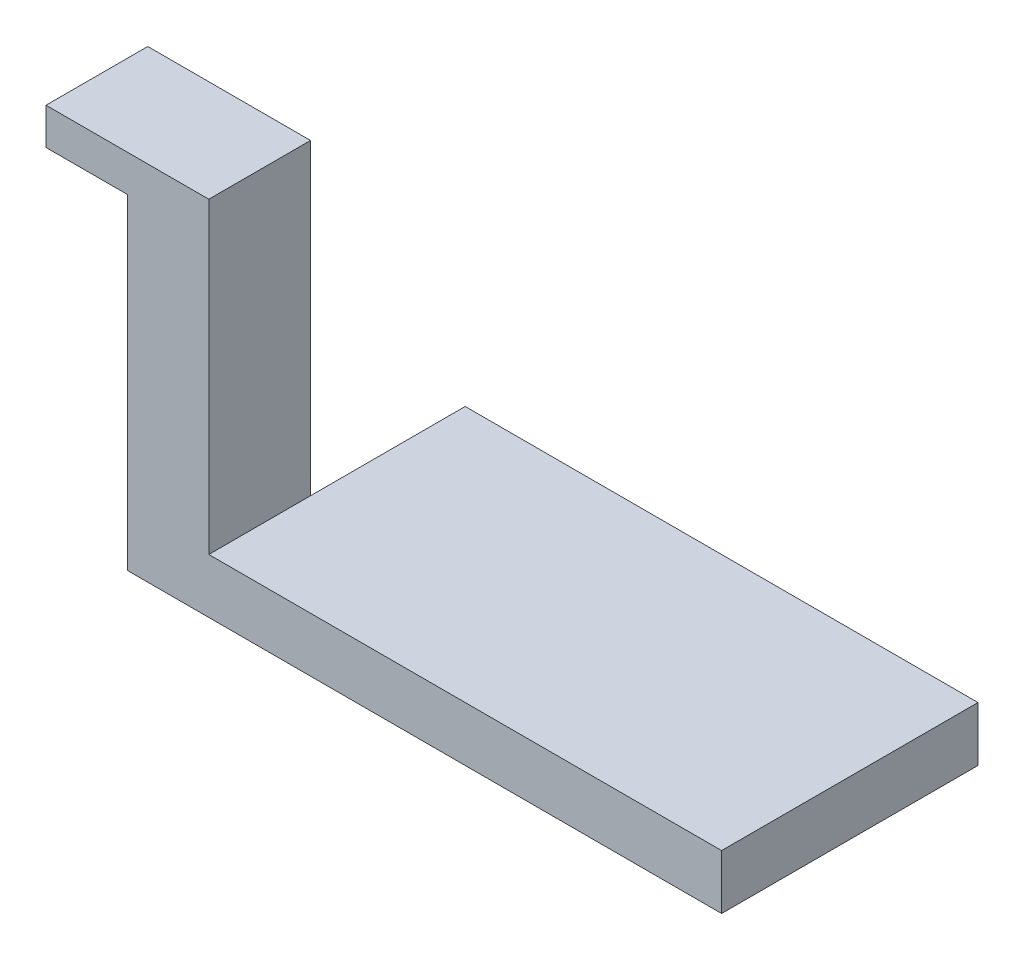
ISO-10303-21;
HEADER;
FILE_DESCRIPTION(('STEP AP214'),'2;1');
FILE_NAME('part.step','',(''),(''),'','','');
FILE_SCHEMA(('AUTOMOTIVE_DESIGN { 1 0 10303 214 1 1 1 1 }'));
ENDSEC;
DATA;
#1=APPLICATION_CONTEXT('core data for automotive mechanical design processes');
#2=APPLICATION_PROTOCOL_DEFINITION('international standard','automotive_design',2000,#1);
#3=PRODUCT_CONTEXT('',#1,'mechanical');
#4=PRODUCT('Part','Part','',(#3));
#5=PRODUCT_RELATED_PRODUCT_CATEGORY('part','',(#4));
#6=PRODUCT_DEFINITION_FORMATION('','',#4);
#7=PRODUCT_DEFINITION_CONTEXT('part definition',#1,'design');
#8=PRODUCT_DEFINITION('design','',#6,#7);
#9=PRODUCT_DEFINITION_SHAPE('','',#8);
#10=(LENGTH_UNIT() NAMED_UNIT(*) SI_UNIT(.MILLI.,.METRE.));
#11=(NAMED_UNIT(*) PLANE_ANGLE_UNIT() SI_UNIT($,.RADIAN.));
#12=(NAMED_UNIT(*) SI_UNIT($,.STERADIAN.) SOLID_ANGLE_UNIT());
#13=UNCERTAINTY_MEASURE_WITH_UNIT(LENGTH_MEASURE(1.E-05),#10,'distance_accuracy_value','');
#14=(GEOMETRIC_REPRESENTATION_CONTEXT(3) GLOBAL_UNCERTAINTY_ASSIGNED_CONTEXT((#13)) GLOBAL_UNIT_ASSIGNED_CONTEXT((#10,
#11,#12)) REPRESENTATION_CONTEXT('',''));
#15=CARTESIAN_POINT('',(0.,0.,0.));
#16=DIRECTION('',(0.,0.,1.));
#17=DIRECTION('',(1.,0.,0.));
#18=AXIS2_PLACEMENT_3D('',#15,#16,#17);
#19=CARTESIAN_POINT('',(10.16,2.286,0.));
#20=DIRECTION('',(-1.,0.,0.));
#21=DIRECTION('',(0.,0.,1.));
#22=AXIS2_PLACEMENT_3D('',#19,#20,#21);
#23=PLANE('',#22);
#24=DIRECTION('',(0.,0.,1.));
#25=VECTOR('',#24,1.);
#26=CARTESIAN_POINT('',(10.16,-16.9164,-16.002));
#27=LINE('',#26,#25);
#28=CARTESIAN_POINT('',(10.16,-16.9164,-6.35));
#29=VERTEX_POINT('',#28);
#30=CARTESIAN_POINT('',(10.16,-16.9164,0.));
#31=VERTEX_POINT('',#30);
#32=EDGE_CURVE('E11',#29,#31,#27,.T.);
#33=ORIENTED_EDGE('',*,*,#32,.F.);
#34=DIRECTION('',(0.,-1.,0.));
#35=VECTOR('',#34,1.);
#36=CARTESIAN_POINT('',(10.16,2.286,-6.35));
#37=LINE('',#36,#35);
#38=CARTESIAN_POINT('',(10.16,2.286,-6.35));
#39=VERTEX_POINT('',#38);
#40=EDGE_CURVE('E273',#39,#29,#37,.T.);
#41=ORIENTED_EDGE('',*,*,#40,.F.);
#42=DIRECTION('',(0.,0.,-1.));
#43=VECTOR('',#42,1.);
#44=CARTESIAN_POINT('',(10.16,2.286,0.));
#45=LINE('',#44,#43);
#46=CARTESIAN_POINT('',(10.16,2.286,0.));
#47=VERTEX_POINT('',#46);
#48=EDGE_CURVE('E254',#47,#39,#45,.T.);
#49=ORIENTED_EDGE('',*,*,#48,.F.);
#50=DIRECTION('',(0.,-1.,0.));
#51=VECTOR('',#50,1.);
#52=CARTESIAN_POINT('',(10.16,2.286,0.));
#53=LINE('',#52,#51);
#54=EDGE_CURVE('E275',#47,#31,#53,.T.);
#55=ORIENTED_EDGE('',*,*,#54,.T.);
#56=EDGE_LOOP('',(#33,#41,#49,#55));
#57=FACE_BOUND('',#56,.T.);
#58=ADVANCED_FACE('F45',(#57),#23,.F.);
#59=CARTESIAN_POINT('',(0.,2.286,0.));
#60=DIRECTION('',(1.,0.,0.));
#61=DIRECTION('',(0.,0.,-1.));
#62=AXIS2_PLACEMENT_3D('',#59,#60,#61);
#63=PLANE('',#62);
#64=DIRECTION('',(0.,0.,1.));
#65=VECTOR('',#64,1.);
#66=CARTESIAN_POINT('',(0.,0.3302,-6.0452));
#67=LINE('',#66,#65);
#68=CARTESIAN_POINT('',(0.,0.3302,-6.0452));
#69=VERTEX_POINT('',#68);
#70=CARTESIAN_POINT('',(0.,0.3302,-0.2032));
#71=VERTEX_POINT('',#70);
#72=EDGE_CURVE('E222',#69,#71,#67,.T.);
#73=ORIENTED_EDGE('',*,*,#72,.F.);
#74=DIRECTION('',(0.,-1.,0.));
#75=VECTOR('',#74,1.);
#76=CARTESIAN_POINT('',(0.,1.9812,-6.0452));
#77=LINE('',#76,#75);
#78=CARTESIAN_POINT('',(0.,1.9812,-6.0452));
#79=VERTEX_POINT('',#78);
#80=EDGE_CURVE('E201',#79,#69,#77,.T.);
#81=ORIENTED_EDGE('',*,*,#80,.F.);
#82=DIRECTION('',(0.,0.,-1.));
#83=VECTOR('',#82,1.);
#84=CARTESIAN_POINT('',(0.,1.9812,-6.0452));
#85=LINE('',#84,#83);
#86=CARTESIAN_POINT('',(0.,1.9812,-0.2032));
#87=VERTEX_POINT('',#86);
#88=EDGE_CURVE('E207',#87,#79,#85,.T.);
#89=ORIENTED_EDGE('',*,*,#88,.F.);
#90=DIRECTION('',(0.,1.,0.));
#91=VECTOR('',#90,1.);
#92=CARTESIAN_POINT('',(0.,1.9812,-0.2032));
#93=LINE('',#92,#91);
#94=EDGE_CURVE('E226',#71,#87,#93,.T.);
#95=ORIENTED_EDGE('',*,*,#94,.F.);
#96=EDGE_LOOP('',(#73,#81,#89,#95));
#97=FACE_BOUND('',#96,.T.);
#98=DIRECTION('',(0.,0.,1.));
#99=VECTOR('',#98,1.);
#100=CARTESIAN_POINT('',(0.,0.,0.));
#101=LINE('',#100,#99);
#102=CARTESIAN_POINT('',(0.,0.,-6.35));
#103=VERTEX_POINT('',#102);
#104=CARTESIAN_POINT('',(0.,0.,0.));
#105=VERTEX_POINT('',#104);
#106=EDGE_CURVE('E236',#103,#105,#101,.T.);
#107=ORIENTED_EDGE('',*,*,#106,.T.);
#108=DIRECTION('',(0.,-1.,0.));
#109=VECTOR('',#108,1.);
#110=CARTESIAN_POINT('',(0.,2.286,0.));
#111=LINE('',#110,#109);
#112=CARTESIAN_POINT('',(0.,2.286,0.));
#113=VERTEX_POINT('',#112);
#114=EDGE_CURVE('E49',#113,#105,#111,.T.);
#115=ORIENTED_EDGE('',*,*,#114,.F.);
#116=DIRECTION('',(0.,0.,1.));
#117=VECTOR('',#116,1.);
#118=CARTESIAN_POINT('',(0.,2.286,0.));
#119=LINE('',#118,#117);
#120=CARTESIAN_POINT('',(0.,2.286,-6.35));
#121=VERTEX_POINT('',#120);
#122=EDGE_CURVE('E246',#121,#113,#119,.T.);
#123=ORIENTED_EDGE('',*,*,#122,.F.);
#124=DIRECTION('',(0.,-1.,0.));
#125=VECTOR('',#124,1.);
#126=CARTESIAN_POINT('',(0.,2.286,-6.35));
#127=LINE('',#126,#125);
#128=EDGE_CURVE('E260',#121,#103,#127,.T.);
#129=ORIENTED_EDGE('',*,*,#128,.T.);
#130=EDGE_LOOP('',(#107,#115,#123,#129));
#131=FACE_BOUND('',#130,.T.);
#132=ADVANCED_FACE('F47',(#97,#131),#63,.F.);
#133=CARTESIAN_POINT('',(0.,2.286,0.));
#134=DIRECTION('',(0.,0.,-1.));
#135=DIRECTION('',(-1.,0.,0.));
#136=AXIS2_PLACEMENT_3D('',#133,#134,#135);
#137=PLANE('',#136);
#138=DIRECTION('',(1.,0.,0.));
#139=VECTOR('',#138,1.);
#140=CARTESIAN_POINT('',(0.,0.,0.));
#141=LINE('',#140,#139);
#142=CARTESIAN_POINT('',(5.08,0.,0.));
#143=VERTEX_POINT('',#142);
#144=EDGE_CURVE('E264',#105,#143,#141,.T.);
#145=ORIENTED_EDGE('',*,*,#144,.T.);
#146=DIRECTION('',(0.,1.,0.));
#147=VECTOR('',#146,1.);
#148=CARTESIAN_POINT('',(5.08,-20.32,0.));
#149=LINE('',#148,#147);
#150=CARTESIAN_POINT('',(5.08,-20.32,0.));
#151=VERTEX_POINT('',#150);
#152=EDGE_CURVE('E197',#151,#143,#149,.T.);
#153=ORIENTED_EDGE('',*,*,#152,.F.);
#154=DIRECTION('',(-1.,0.,0.));
#155=VECTOR('',#154,1.);
#156=CARTESIAN_POINT('',(10.16,-20.32,0.));
#157=LINE('',#156,#155);
#158=CARTESIAN_POINT('',(42.164,-20.32,0.));
#159=VERTEX_POINT('',#158);
#160=EDGE_CURVE('E178',#159,#151,#157,.T.);
#161=ORIENTED_EDGE('',*,*,#160,.F.);
#162=DIRECTION('',(0.,-1.,0.));
#163=VECTOR('',#162,1.);
#164=CARTESIAN_POINT('',(42.164,-20.32,0.));
#165=LINE('',#164,#163);
#166=CARTESIAN_POINT('',(42.164,-16.9164,0.));
#167=VERTEX_POINT('',#166);
#168=EDGE_CURVE('E158',#167,#159,#165,.T.);
#169=ORIENTED_EDGE('',*,*,#168,.F.);
#170=DIRECTION('',(-1.,0.,0.));
#171=VECTOR('',#170,1.);
#172=CARTESIAN_POINT('',(42.164,-16.9164,0.));
#173=LINE('',#172,#171);
#174=EDGE_CURVE('E153',#167,#31,#173,.T.);
#175=ORIENTED_EDGE('',*,*,#174,.T.);
#176=ORIENTED_EDGE('',*,*,#54,.F.);
#177=DIRECTION('',(1.,0.,0.));
#178=VECTOR('',#177,1.);
#179=CARTESIAN_POINT('',(0.,2.286,0.));
#180=LINE('',#179,#178);
#181=EDGE_CURVE('E250',#113,#47,#180,.T.);
#182=ORIENTED_EDGE('',*,*,#181,.F.);
#183=ORIENTED_EDGE('',*,*,#114,.T.);
#184=EDGE_LOOP('',(#145,#153,#161,#169,#175,#176,#182,#183));
#185=FACE_BOUND('',#184,.T.);
#186=ADVANCED_FACE('F283',(#185),#137,.F.);
#187=CARTESIAN_POINT('',(0.,2.286,-6.35));
#188=DIRECTION('',(0.,0.,1.));
#189=DIRECTION('',(1.,0.,0.));
#190=AXIS2_PLACEMENT_3D('',#187,#188,#189);
#191=PLANE('',#190);
#192=ORIENTED_EDGE('',*,*,#40,.T.);
#193=CARTESIAN_POINT('',(10.16,-20.32,-6.35));
#194=VERTEX_POINT('',#193);
#195=EDGE_CURVE('E272',#29,#194,#37,.T.);
#196=ORIENTED_EDGE('',*,*,#195,.T.);
#197=DIRECTION('',(1.,0.,0.));
#198=VECTOR('',#197,1.);
#199=CARTESIAN_POINT('',(10.16,-20.32,-6.35));
#200=LINE('',#199,#198);
#201=CARTESIAN_POINT('',(5.08,-20.32,-6.35));
#202=VERTEX_POINT('',#201);
#203=EDGE_CURVE('E189',#202,#194,#200,.T.);
#204=ORIENTED_EDGE('',*,*,#203,.F.);
#205=DIRECTION('',(0.,1.,0.));
#206=VECTOR('',#205,1.);
#207=CARTESIAN_POINT('',(5.08,-20.32,-6.35));
#208=LINE('',#207,#206);
#209=CARTESIAN_POINT('',(5.08,0.,-6.35));
#210=VERTEX_POINT('',#209);
#211=EDGE_CURVE('E192',#202,#210,#208,.T.);
#212=ORIENTED_EDGE('',*,*,#211,.T.);
#213=DIRECTION('',(-1.,0.,0.));
#214=VECTOR('',#213,1.);
#215=CARTESIAN_POINT('',(0.,0.,-6.35));
#216=LINE('',#215,#214);
#217=EDGE_CURVE('E251',#210,#103,#216,.T.);
#218=ORIENTED_EDGE('',*,*,#217,.T.);
#219=ORIENTED_EDGE('',*,*,#128,.F.);
#220=DIRECTION('',(-1.,0.,0.));
#221=VECTOR('',#220,1.);
#222=CARTESIAN_POINT('',(0.,2.286,-6.35));
#223=LINE('',#222,#221);
#224=EDGE_CURVE('E257',#39,#121,#223,.T.);
#225=ORIENTED_EDGE('',*,*,#224,.F.);
#226=EDGE_LOOP('',(#192,#196,#204,#212,#218,#219,#225));
#227=FACE_BOUND('',#226,.T.);
#228=ADVANCED_FACE('F296',(#227),#191,.F.);
#229=CARTESIAN_POINT('',(0.,2.286,0.));
#230=DIRECTION('',(0.,-1.,0.));
#231=DIRECTION('',(0.,0.,-1.));
#232=AXIS2_PLACEMENT_3D('',#229,#230,#231);
#233=PLANE('',#232);
#234=ORIENTED_EDGE('',*,*,#122,.T.);
#235=ORIENTED_EDGE('',*,*,#181,.T.);
#236=ORIENTED_EDGE('',*,*,#48,.T.);
#237=ORIENTED_EDGE('',*,*,#224,.T.);
#238=EDGE_LOOP('',(#234,#235,#236,#237));
#239=FACE_BOUND('',#238,.T.);
#240=ADVANCED_FACE('F315',(#239),#233,.F.);
#241=CARTESIAN_POINT('',(0.,0.,0.));
#242=DIRECTION('',(0.,-1.,0.));
#243=DIRECTION('',(0.,0.,-1.));
#244=AXIS2_PLACEMENT_3D('',#241,#242,#243);
#245=PLANE('',#244);
#246=DIRECTION('',(0.,0.,-1.));
#247=VECTOR('',#246,1.);
#248=CARTESIAN_POINT('',(5.08,0.,-6.35));
#249=LINE('',#248,#247);
#250=EDGE_CURVE('E69',#143,#210,#249,.T.);
#251=ORIENTED_EDGE('',*,*,#250,.F.);
#252=ORIENTED_EDGE('',*,*,#144,.F.);
#253=ORIENTED_EDGE('',*,*,#106,.F.);
#254=ORIENTED_EDGE('',*,*,#217,.F.);
#255=EDGE_LOOP('',(#251,#252,#253,#254));
#256=FACE_BOUND('',#255,.T.);
#257=ADVANCED_FACE('F289',(#256),#245,.T.);
#258=CARTESIAN_POINT('',(8.89,1.9812,-6.0452));
#259=DIRECTION('',(0.,0.,-1.));
#260=DIRECTION('',(-1.,0.,0.));
#261=AXIS2_PLACEMENT_3D('',#258,#259,#260);
#262=PLANE('',#261);
#263=ORIENTED_EDGE('',*,*,#80,.T.);
#264=DIRECTION('',(-1.,0.,0.));
#265=VECTOR('',#264,1.);
#266=CARTESIAN_POINT('',(8.89,0.3302,-6.0452));
#267=LINE('',#266,#265);
#268=CARTESIAN_POINT('',(8.89,0.3302,-6.0452));
#269=VERTEX_POINT('',#268);
#270=EDGE_CURVE('E219',#269,#69,#267,.T.);
#271=ORIENTED_EDGE('',*,*,#270,.F.);
#272=DIRECTION('',(0.,-1.,0.));
#273=VECTOR('',#272,1.);
#274=CARTESIAN_POINT('',(8.89,1.9812,-6.0452));
#275=LINE('',#274,#273);
#276=CARTESIAN_POINT('',(8.89,1.9812,-6.0452));
#277=VERTEX_POINT('',#276);
#278=EDGE_CURVE('E202',#277,#269,#275,.T.);
#279=ORIENTED_EDGE('',*,*,#278,.F.);
#280=DIRECTION('',(-1.,0.,0.));
#281=VECTOR('',#280,1.);
#282=CARTESIAN_POINT('',(8.89,1.9812,-6.0452));
#283=LINE('',#282,#281);
#284=EDGE_CURVE('E233',#277,#79,#283,.T.);
#285=ORIENTED_EDGE('',*,*,#284,.T.);
#286=EDGE_LOOP('',(#263,#271,#279,#285));
#287=FACE_BOUND('',#286,.T.);
#288=ADVANCED_FACE('F322',(#287),#262,.F.);
#289=CARTESIAN_POINT('',(8.89,1.9812,-6.0452));
#290=DIRECTION('',(0.,1.,0.));
#291=DIRECTION('',(0.,0.,1.));
#292=AXIS2_PLACEMENT_3D('',#289,#290,#291);
#293=PLANE('',#292);
#294=ORIENTED_EDGE('',*,*,#88,.T.);
#295=ORIENTED_EDGE('',*,*,#284,.F.);
#296=DIRECTION('',(0.,0.,-1.));
#297=VECTOR('',#296,1.);
#298=CARTESIAN_POINT('',(8.89,1.9812,-6.0452));
#299=LINE('',#298,#297);
#300=CARTESIAN_POINT('',(8.89,1.9812,-0.2032));
#301=VERTEX_POINT('',#300);
#302=EDGE_CURVE('E215',#301,#277,#299,.T.);
#303=ORIENTED_EDGE('',*,*,#302,.F.);
#304=DIRECTION('',(-1.,0.,0.));
#305=VECTOR('',#304,1.);
#306=CARTESIAN_POINT('',(8.89,1.9812,-0.2032));
#307=LINE('',#306,#305);
#308=EDGE_CURVE('E237',#301,#87,#307,.T.);
#309=ORIENTED_EDGE('',*,*,#308,.T.);
#310=EDGE_LOOP('',(#294,#295,#303,#309));
#311=FACE_BOUND('',#310,.T.);
#312=ADVANCED_FACE('F422',(#311),#293,.F.);
#313=CARTESIAN_POINT('',(8.89,1.9812,-0.2032));
#314=DIRECTION('',(0.,0.,1.));
#315=DIRECTION('',(1.,0.,0.));
#316=AXIS2_PLACEMENT_3D('',#313,#314,#315);
#317=PLANE('',#316);
#318=ORIENTED_EDGE('',*,*,#94,.T.);
#319=ORIENTED_EDGE('',*,*,#308,.F.);
#320=DIRECTION('',(0.,1.,0.));
#321=VECTOR('',#320,1.);
#322=CARTESIAN_POINT('',(8.89,1.9812,-0.2032));
#323=LINE('',#322,#321);
#324=CARTESIAN_POINT('',(8.89,0.3302,-0.2032));
#325=VERTEX_POINT('',#324);
#326=EDGE_CURVE('E211',#325,#301,#323,.T.);
#327=ORIENTED_EDGE('',*,*,#326,.F.);
#328=DIRECTION('',(-1.,0.,0.));
#329=VECTOR('',#328,1.);
#330=CARTESIAN_POINT('',(8.89,0.3302,-0.2032));
#331=LINE('',#330,#329);
#332=EDGE_CURVE('E240',#325,#71,#331,.T.);
#333=ORIENTED_EDGE('',*,*,#332,.T.);
#334=EDGE_LOOP('',(#318,#319,#327,#333));
#335=FACE_BOUND('',#334,.T.);
#336=ADVANCED_FACE('F413',(#335),#317,.F.);
#337=CARTESIAN_POINT('',(8.89,0.3302,-6.0452));
#338=DIRECTION('',(0.,-1.,0.));
#339=DIRECTION('',(0.,0.,-1.));
#340=AXIS2_PLACEMENT_3D('',#337,#338,#339);
#341=PLANE('',#340);
#342=ORIENTED_EDGE('',*,*,#72,.T.);
#343=ORIENTED_EDGE('',*,*,#332,.F.);
#344=DIRECTION('',(0.,0.,1.));
#345=VECTOR('',#344,1.);
#346=CARTESIAN_POINT('',(8.89,0.3302,-6.0452));
#347=LINE('',#346,#345);
#348=EDGE_CURVE('E206',#269,#325,#347,.T.);
#349=ORIENTED_EDGE('',*,*,#348,.F.);
#350=ORIENTED_EDGE('',*,*,#270,.T.);
#351=EDGE_LOOP('',(#342,#343,#349,#350));
#352=FACE_BOUND('',#351,.T.);
#353=ADVANCED_FACE('F404',(#352),#341,.F.);
#354=CARTESIAN_POINT('',(8.89,0.,0.));
#355=DIRECTION('',(-1.,0.,0.));
#356=DIRECTION('',(0.,0.,1.));
#357=AXIS2_PLACEMENT_3D('',#354,#355,#356);
#358=PLANE('',#357);
#359=ORIENTED_EDGE('',*,*,#278,.T.);
#360=ORIENTED_EDGE('',*,*,#348,.T.);
#361=ORIENTED_EDGE('',*,*,#326,.T.);
#362=ORIENTED_EDGE('',*,*,#302,.T.);
#363=EDGE_LOOP('',(#359,#360,#361,#362));
#364=FACE_BOUND('',#363,.T.);
#365=ADVANCED_FACE('F396',(#364),#358,.T.);
#366=CARTESIAN_POINT('',(5.08,-20.32,-6.35));
#367=DIRECTION('',(1.,0.,0.));
#368=DIRECTION('',(0.,0.,-1.));
#369=AXIS2_PLACEMENT_3D('',#366,#367,#368);
#370=PLANE('',#369);
#371=ORIENTED_EDGE('',*,*,#250,.T.);
#372=ORIENTED_EDGE('',*,*,#211,.F.);
#373=DIRECTION('',(0.,0.,-1.));
#374=VECTOR('',#373,1.);
#375=CARTESIAN_POINT('',(5.08,-20.32,-6.35));
#376=LINE('',#375,#374);
#377=EDGE_CURVE('E186',#151,#202,#376,.T.);
#378=ORIENTED_EDGE('',*,*,#377,.F.);
#379=ORIENTED_EDGE('',*,*,#152,.T.);
#380=EDGE_LOOP('',(#371,#372,#378,#379));
#381=FACE_BOUND('',#380,.T.);
#382=ADVANCED_FACE('F293',(#381),#370,.F.);
#383=CARTESIAN_POINT('',(0.,-20.32,0.));
#384=DIRECTION('',(0.,-1.,0.));
#385=DIRECTION('',(0.,0.,-1.));
#386=AXIS2_PLACEMENT_3D('',#383,#384,#385);
#387=PLANE('',#386);
#388=ORIENTED_EDGE('',*,*,#203,.T.);
#389=DIRECTION('',(0.,0.,-1.));
#390=VECTOR('',#389,1.);
#391=CARTESIAN_POINT('',(10.16,-20.32,-16.002));
#392=LINE('',#391,#390);
#393=CARTESIAN_POINT('',(10.16,-20.32,-16.002));
#394=VERTEX_POINT('',#393);
#395=EDGE_CURVE('E169',#194,#394,#392,.T.);
#396=ORIENTED_EDGE('',*,*,#395,.T.);
#397=DIRECTION('',(-1.,0.,0.));
#398=VECTOR('',#397,1.);
#399=CARTESIAN_POINT('',(42.164,-20.32,-16.002));
#400=LINE('',#399,#398);
#401=CARTESIAN_POINT('',(42.164,-20.32,-16.002));
#402=VERTEX_POINT('',#401);
#403=EDGE_CURVE('E180',#402,#394,#400,.T.);
#404=ORIENTED_EDGE('',*,*,#403,.F.);
#405=DIRECTION('',(0.,0.,-1.));
#406=VECTOR('',#405,1.);
#407=CARTESIAN_POINT('',(42.164,-20.32,-16.002));
#408=LINE('',#407,#406);
#409=EDGE_CURVE('E164',#159,#402,#408,.T.);
#410=ORIENTED_EDGE('',*,*,#409,.F.);
#411=ORIENTED_EDGE('',*,*,#160,.T.);
#412=ORIENTED_EDGE('',*,*,#377,.T.);
#413=EDGE_LOOP('',(#388,#396,#404,#410,#411,#412));
#414=FACE_BOUND('',#413,.T.);
#415=ADVANCED_FACE('F300',(#414),#387,.T.);
#416=CARTESIAN_POINT('',(42.164,-20.32,-16.002));
#417=DIRECTION('',(0.,0.,1.));
#418=DIRECTION('',(1.,0.,0.));
#419=AXIS2_PLACEMENT_3D('',#416,#417,#418);
#420=PLANE('',#419);
#421=DIRECTION('',(0.,1.,0.));
#422=VECTOR('',#421,1.);
#423=CARTESIAN_POINT('',(10.16,-20.32,-16.002));
#424=LINE('',#423,#422);
#425=CARTESIAN_POINT('',(10.16,-16.9164,-16.002));
#426=VERTEX_POINT('',#425);
#427=EDGE_CURVE('E173',#394,#426,#424,.T.);
#428=ORIENTED_EDGE('',*,*,#427,.T.);
#429=DIRECTION('',(-1.,0.,0.));
#430=VECTOR('',#429,1.);
#431=CARTESIAN_POINT('',(42.164,-16.9164,-16.002));
#432=LINE('',#431,#430);
#433=CARTESIAN_POINT('',(42.164,-16.9164,-16.002));
#434=VERTEX_POINT('',#433);
#435=EDGE_CURVE('E150',#434,#426,#432,.T.);
#436=ORIENTED_EDGE('',*,*,#435,.F.);
#437=DIRECTION('',(0.,1.,0.));
#438=VECTOR('',#437,1.);
#439=CARTESIAN_POINT('',(42.164,-20.32,-16.002));
#440=LINE('',#439,#438);
#441=EDGE_CURVE('E159',#402,#434,#440,.T.);
#442=ORIENTED_EDGE('',*,*,#441,.F.);
#443=ORIENTED_EDGE('',*,*,#403,.T.);
#444=EDGE_LOOP('',(#428,#436,#442,#443));
#445=FACE_BOUND('',#444,.T.);
#446=ADVANCED_FACE('F171',(#445),#420,.F.);
#447=CARTESIAN_POINT('',(42.164,-16.9164,-16.002));
#448=DIRECTION('',(0.,-1.,0.));
#449=DIRECTION('',(0.,0.,-1.));
#450=AXIS2_PLACEMENT_3D('',#447,#448,#449);
#451=PLANE('',#450);
#452=EDGE_CURVE('E56',#426,#29,#27,.T.);
#453=ORIENTED_EDGE('',*,*,#452,.T.);
#454=ORIENTED_EDGE('',*,*,#32,.T.);
#455=ORIENTED_EDGE('',*,*,#174,.F.);
#456=DIRECTION('',(0.,0.,1.));
#457=VECTOR('',#456,1.);
#458=CARTESIAN_POINT('',(42.164,-16.9164,-16.002));
#459=LINE('',#458,#457);
#460=EDGE_CURVE('E145',#434,#167,#459,.T.);
#461=ORIENTED_EDGE('',*,*,#460,.F.);
#462=ORIENTED_EDGE('',*,*,#435,.T.);
#463=EDGE_LOOP('',(#453,#454,#455,#461,#462));
#464=FACE_BOUND('',#463,.T.);
#465=ADVANCED_FACE('F148',(#464),#451,.F.);
#466=CARTESIAN_POINT('',(42.164,0.,0.));
#467=DIRECTION('',(1.,0.,0.));
#468=DIRECTION('',(0.,0.,-1.));
#469=AXIS2_PLACEMENT_3D('',#466,#467,#468);
#470=PLANE('',#469);
#471=ORIENTED_EDGE('',*,*,#441,.T.);
#472=ORIENTED_EDGE('',*,*,#460,.T.);
#473=ORIENTED_EDGE('',*,*,#168,.T.);
#474=ORIENTED_EDGE('',*,*,#409,.T.);
#475=EDGE_LOOP('',(#471,#472,#473,#474));
#476=FACE_BOUND('',#475,.T.);
#477=ADVANCED_FACE('F162',(#476),#470,.T.);
#478=CARTESIAN_POINT('',(10.16,0.,0.));
#479=DIRECTION('',(1.,0.,0.));
#480=DIRECTION('',(0.,0.,-1.));
#481=AXIS2_PLACEMENT_3D('',#478,#479,#480);
#482=PLANE('',#481);
#483=ORIENTED_EDGE('',*,*,#195,.F.);
#484=ORIENTED_EDGE('',*,*,#452,.F.);
#485=ORIENTED_EDGE('',*,*,#427,.F.);
#486=ORIENTED_EDGE('',*,*,#395,.F.);
#487=EDGE_LOOP('',(#483,#484,#485,#486));
#488=FACE_BOUND('',#487,.T.);
#489=ADVANCED_FACE('F302',(#488),#482,.F.);
#490=CLOSED_SHELL('',(#58,#132,#186,#228,#240,#257,#288,#312,#336,#353,#365,#382,#415,#446,#465,
#477,#489));
#491=MANIFOLD_SOLID_BREP('B2',#490);
#492=ADVANCED_BREP_SHAPE_REPRESENTATION('',(#18,#491),#14);
#493=SHAPE_DEFINITION_REPRESENTATION(#9,#492);
ENDSEC;
END-ISO-10303-21;
